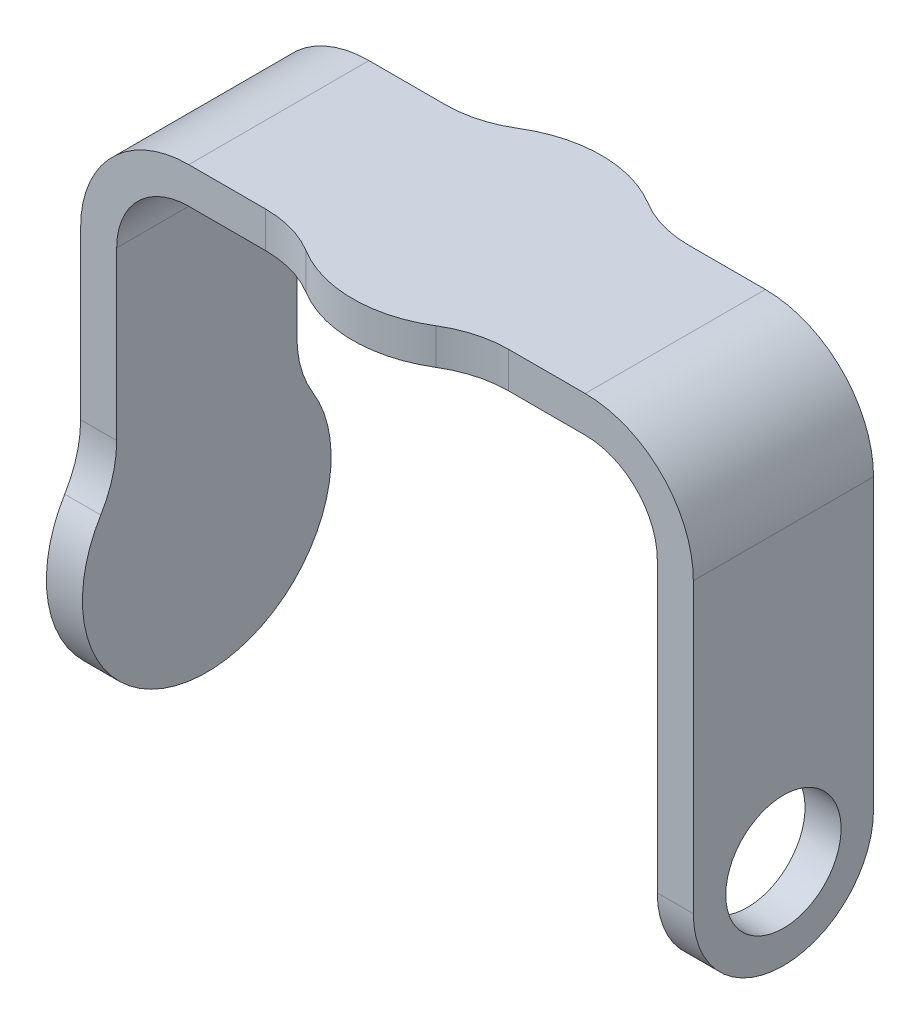
ISO-10303-21;
HEADER;
FILE_DESCRIPTION(('STEP AP214'),'2;1');
FILE_NAME('part.step','',(''),(''),'','','');
FILE_SCHEMA(('AUTOMOTIVE_DESIGN { 1 0 10303 214 1 1 1 1 }'));
ENDSEC;
DATA;
#1=APPLICATION_CONTEXT('core data for automotive mechanical design processes');
#2=APPLICATION_PROTOCOL_DEFINITION('international standard','automotive_design',2000,#1);
#3=PRODUCT_CONTEXT('',#1,'mechanical');
#4=PRODUCT('Part','Part','',(#3));
#5=PRODUCT_RELATED_PRODUCT_CATEGORY('part','',(#4));
#6=PRODUCT_DEFINITION_FORMATION('','',#4);
#7=PRODUCT_DEFINITION_CONTEXT('part definition',#1,'design');
#8=PRODUCT_DEFINITION('design','',#6,#7);
#9=PRODUCT_DEFINITION_SHAPE('','',#8);
#10=(LENGTH_UNIT() NAMED_UNIT(*) SI_UNIT(.MILLI.,.METRE.));
#11=(NAMED_UNIT(*) PLANE_ANGLE_UNIT() SI_UNIT($,.RADIAN.));
#12=(NAMED_UNIT(*) SI_UNIT($,.STERADIAN.) SOLID_ANGLE_UNIT());
#13=UNCERTAINTY_MEASURE_WITH_UNIT(LENGTH_MEASURE(1.E-05),#10,'distance_accuracy_value','');
#14=(GEOMETRIC_REPRESENTATION_CONTEXT(3) GLOBAL_UNCERTAINTY_ASSIGNED_CONTEXT((#13)) GLOBAL_UNIT_ASSIGNED_CONTEXT((#10,
#11,#12)) REPRESENTATION_CONTEXT('',''));
#15=CARTESIAN_POINT('',(0.,0.,0.));
#16=DIRECTION('',(0.,0.,1.));
#17=DIRECTION('',(1.,0.,0.));
#18=AXIS2_PLACEMENT_3D('',#15,#16,#17);
#19=CARTESIAN_POINT('',(-27.5,-10.,12.5));
#20=DIRECTION('',(0.,0.,-1.));
#21=DIRECTION('',(-1.,0.,0.));
#22=AXIS2_PLACEMENT_3D('',#19,#20,#21);
#23=PLANE('',#22);
#24=DIRECTION('',(0.,-1.,0.));
#25=VECTOR('',#24,1.);
#26=CARTESIAN_POINT('',(-42.5,-10.0000000000001,12.5));
#27=LINE('',#26,#25);
#28=CARTESIAN_POINT('',(-42.5,-10.0000000000001,12.5));
#29=VERTEX_POINT('',#28);
#30=CARTESIAN_POINT('',(-42.5,-33.1532644111686,12.5));
#31=VERTEX_POINT('',#30);
#32=EDGE_CURVE('E227',#29,#31,#27,.T.);
#33=ORIENTED_EDGE('',*,*,#32,.T.);
#34=DIRECTION('',(-1.,0.,0.));
#35=VECTOR('',#34,1.);
#36=CARTESIAN_POINT('',(-27.5,-33.1532644111686,12.5));
#37=LINE('',#36,#35);
#38=CARTESIAN_POINT('',(-37.5,-33.1532644111686,12.5));
#39=VERTEX_POINT('',#38);
#40=EDGE_CURVE('E361',#31,#39,#37,.F.);
#41=ORIENTED_EDGE('',*,*,#40,.T.);
#42=DIRECTION('',(0.,1.,0.));
#43=VECTOR('',#42,1.);
#44=CARTESIAN_POINT('',(-37.5,-67.25,12.5));
#45=LINE('',#44,#43);
#46=CARTESIAN_POINT('',(-37.5,-10.0000000000001,12.5));
#47=VERTEX_POINT('',#46);
#48=EDGE_CURVE('E269',#39,#47,#45,.T.);
#49=ORIENTED_EDGE('',*,*,#48,.T.);
#50=CARTESIAN_POINT('',(-27.5,-10.,12.5));
#51=DIRECTION('',(0.,0.,-1.));
#52=DIRECTION('',(-1.,0.,0.));
#53=AXIS2_PLACEMENT_3D('',#50,#51,#52);
#54=CIRCLE('',#53,10.);
#55=CARTESIAN_POINT('',(-27.4999999999999,0.,12.5));
#56=VERTEX_POINT('',#55);
#57=EDGE_CURVE('E427',#47,#56,#54,.T.);
#58=ORIENTED_EDGE('',*,*,#57,.T.);
#59=DIRECTION('',(1.,0.,0.));
#60=VECTOR('',#59,1.);
#61=CARTESIAN_POINT('',(-27.4999999999999,0.,12.5));
#62=LINE('',#61,#60);
#63=CARTESIAN_POINT('',(-16.8467355888314,0.,12.5));
#64=VERTEX_POINT('',#63);
#65=EDGE_CURVE('E431',#56,#64,#62,.T.);
#66=ORIENTED_EDGE('',*,*,#65,.T.);
#67=DIRECTION('',(0.,1.,0.));
#68=VECTOR('',#67,1.);
#69=CARTESIAN_POINT('',(-16.8467355888314,-10.,12.5));
#70=LINE('',#69,#68);
#71=CARTESIAN_POINT('',(-16.8467355888315,4.99999999999999,12.5));
#72=VERTEX_POINT('',#71);
#73=EDGE_CURVE('E309',#64,#72,#70,.T.);
#74=ORIENTED_EDGE('',*,*,#73,.T.);
#75=DIRECTION('',(-1.,0.,0.));
#76=VECTOR('',#75,1.);
#77=CARTESIAN_POINT('',(27.4999999999999,5.,12.5));
#78=LINE('',#77,#76);
#79=CARTESIAN_POINT('',(-27.4999999999999,4.99999999999999,12.5));
#80=VERTEX_POINT('',#79);
#81=EDGE_CURVE('E214',#72,#80,#78,.T.);
#82=ORIENTED_EDGE('',*,*,#81,.T.);
#83=CARTESIAN_POINT('',(-27.5,-10.,12.5));
#84=DIRECTION('',(0.,0.,1.));
#85=DIRECTION('',(1.,0.,0.));
#86=AXIS2_PLACEMENT_3D('',#83,#84,#85);
#87=CIRCLE('',#86,15.);
#88=EDGE_CURVE('E224',#80,#29,#87,.T.);
#89=ORIENTED_EDGE('',*,*,#88,.T.);
#90=EDGE_LOOP('',(#33,#41,#49,#58,#66,#74,#82,#89));
#91=FACE_BOUND('',#90,.T.);
#92=ADVANCED_FACE('F39',(#91),#23,.F.);
#93=CARTESIAN_POINT('',(-27.5,-10.,-12.5));
#94=DIRECTION('',(0.,0.,-1.));
#95=DIRECTION('',(-1.,0.,0.));
#96=AXIS2_PLACEMENT_3D('',#93,#94,#95);
#97=PLANE('',#96);
#98=DIRECTION('',(0.,1.,0.));
#99=VECTOR('',#98,1.);
#100=CARTESIAN_POINT('',(-37.5,-67.25,-12.5));
#101=LINE('',#100,#99);
#102=CARTESIAN_POINT('',(-37.5,-33.1532644111686,-12.5));
#103=VERTEX_POINT('',#102);
#104=CARTESIAN_POINT('',(-37.5,-10.0000000000001,-12.5));
#105=VERTEX_POINT('',#104);
#106=EDGE_CURVE('E232',#103,#105,#101,.T.);
#107=ORIENTED_EDGE('',*,*,#106,.F.);
#108=DIRECTION('',(1.,0.,0.));
#109=VECTOR('',#108,1.);
#110=CARTESIAN_POINT('',(-42.5,-33.1532644111686,-12.5));
#111=LINE('',#110,#109);
#112=CARTESIAN_POINT('',(-42.5,-33.1532644111686,-12.5));
#113=VERTEX_POINT('',#112);
#114=EDGE_CURVE('E358',#103,#113,#111,.F.);
#115=ORIENTED_EDGE('',*,*,#114,.T.);
#116=DIRECTION('',(0.,-1.,0.));
#117=VECTOR('',#116,1.);
#118=CARTESIAN_POINT('',(-42.5,-10.0000000000001,-12.5));
#119=LINE('',#118,#117);
#120=CARTESIAN_POINT('',(-42.5,-10.0000000000001,-12.5));
#121=VERTEX_POINT('',#120);
#122=EDGE_CURVE('E265',#121,#113,#119,.T.);
#123=ORIENTED_EDGE('',*,*,#122,.F.);
#124=CARTESIAN_POINT('',(-27.5,-10.,-12.5));
#125=DIRECTION('',(0.,0.,1.));
#126=DIRECTION('',(1.,0.,0.));
#127=AXIS2_PLACEMENT_3D('',#124,#125,#126);
#128=CIRCLE('',#127,15.);
#129=CARTESIAN_POINT('',(-27.4999999999999,4.99999999999999,-12.5));
#130=VERTEX_POINT('',#129);
#131=EDGE_CURVE('E262',#130,#121,#128,.T.);
#132=ORIENTED_EDGE('',*,*,#131,.F.);
#133=DIRECTION('',(-1.,0.,0.));
#134=VECTOR('',#133,1.);
#135=CARTESIAN_POINT('',(27.4999999999999,5.,-12.5));
#136=LINE('',#135,#134);
#137=CARTESIAN_POINT('',(-16.8467355888315,4.99999999999999,-12.5));
#138=VERTEX_POINT('',#137);
#139=EDGE_CURVE('E257',#138,#130,#136,.T.);
#140=ORIENTED_EDGE('',*,*,#139,.F.);
#141=DIRECTION('',(0.,-1.,0.));
#142=VECTOR('',#141,1.);
#143=CARTESIAN_POINT('',(-16.8467355888314,0.,-12.5));
#144=LINE('',#143,#142);
#145=CARTESIAN_POINT('',(-16.8467355888314,0.,-12.5));
#146=VERTEX_POINT('',#145);
#147=EDGE_CURVE('E321',#138,#146,#144,.T.);
#148=ORIENTED_EDGE('',*,*,#147,.T.);
#149=DIRECTION('',(1.,0.,0.));
#150=VECTOR('',#149,1.);
#151=CARTESIAN_POINT('',(-27.4999999999999,0.,-12.5));
#152=LINE('',#151,#150);
#153=CARTESIAN_POINT('',(-27.4999999999999,0.,-12.5));
#154=VERTEX_POINT('',#153);
#155=EDGE_CURVE('E240',#154,#146,#152,.T.);
#156=ORIENTED_EDGE('',*,*,#155,.F.);
#157=CARTESIAN_POINT('',(-27.5,-10.,-12.5));
#158=DIRECTION('',(0.,0.,-1.));
#159=DIRECTION('',(-1.,0.,0.));
#160=AXIS2_PLACEMENT_3D('',#157,#158,#159);
#161=CIRCLE('',#160,10.);
#162=EDGE_CURVE('E235',#105,#154,#161,.T.);
#163=ORIENTED_EDGE('',*,*,#162,.F.);
#164=EDGE_LOOP('',(#107,#115,#123,#132,#140,#148,#156,#163));
#165=FACE_BOUND('',#164,.T.);
#166=ADVANCED_FACE('F402',(#165),#97,.T.);
#167=CARTESIAN_POINT('',(-37.5,-67.25,12.5));
#168=DIRECTION('',(-1.,0.,0.));
#169=DIRECTION('',(0.,0.,1.));
#170=AXIS2_PLACEMENT_3D('',#167,#168,#169);
#171=PLANE('',#170);
#172=ORIENTED_EDGE('',*,*,#48,.F.);
#173=CARTESIAN_POINT('',(-37.5,-33.1532644111686,27.5));
#174=DIRECTION('',(-1.,0.,0.));
#175=DIRECTION('',(0.,0.,1.));
#176=AXIS2_PLACEMENT_3D('',#173,#174,#175);
#177=CIRCLE('',#176,15.);
#178=CARTESIAN_POINT('',(-37.5,-40.9889553827181,14.7093023255814));
#179=VERTEX_POINT('',#178);
#180=EDGE_CURVE('E48',#39,#179,#177,.T.);
#181=ORIENTED_EDGE('',*,*,#180,.T.);
#182=CARTESIAN_POINT('',(-37.5,-50.,0.));
#183=DIRECTION('',(-1.,0.,0.));
#184=DIRECTION('',(0.,-1.,0.));
#185=AXIS2_PLACEMENT_3D('',#182,#183,#184);
#186=CIRCLE('',#185,17.25);
#187=CARTESIAN_POINT('',(-37.5,-40.9889553827181,-14.7093023255814));
#188=VERTEX_POINT('',#187);
#189=EDGE_CURVE('E375',#188,#179,#186,.T.);
#190=ORIENTED_EDGE('',*,*,#189,.F.);
#191=CARTESIAN_POINT('',(-37.5,-33.1532644111686,-27.5));
#192=DIRECTION('',(-1.,0.,0.));
#193=DIRECTION('',(0.,0.,1.));
#194=AXIS2_PLACEMENT_3D('',#191,#192,#193);
#195=CIRCLE('',#194,15.);
#196=EDGE_CURVE('E364',#188,#103,#195,.T.);
#197=ORIENTED_EDGE('',*,*,#196,.T.);
#198=ORIENTED_EDGE('',*,*,#106,.T.);
#199=DIRECTION('',(0.,0.,-1.));
#200=VECTOR('',#199,1.);
#201=CARTESIAN_POINT('',(-37.5,-10.0000000000001,12.5));
#202=LINE('',#201,#200);
#203=EDGE_CURVE('E295',#47,#105,#202,.T.);
#204=ORIENTED_EDGE('',*,*,#203,.F.);
#205=EDGE_LOOP('',(#172,#181,#190,#197,#198,#204));
#206=FACE_BOUND('',#205,.T.);
#207=ADVANCED_FACE('F374',(#206),#171,.F.);
#208=CARTESIAN_POINT('',(-27.5,-10.,12.5));
#209=DIRECTION('',(0.,0.,-1.));
#210=DIRECTION('',(-1.,0.,0.));
#211=AXIS2_PLACEMENT_3D('',#208,#209,#210);
#212=CYLINDRICAL_SURFACE('',#211,10.);
#213=ORIENTED_EDGE('',*,*,#162,.T.);
#214=DIRECTION('',(0.,0.,-1.));
#215=VECTOR('',#214,1.);
#216=CARTESIAN_POINT('',(-27.4999999999999,0.,12.5));
#217=LINE('',#216,#215);
#218=EDGE_CURVE('E291',#56,#154,#217,.T.);
#219=ORIENTED_EDGE('',*,*,#218,.F.);
#220=ORIENTED_EDGE('',*,*,#57,.F.);
#221=ORIENTED_EDGE('',*,*,#203,.T.);
#222=EDGE_LOOP('',(#213,#219,#220,#221));
#223=FACE_BOUND('',#222,.T.);
#224=ADVANCED_FACE('F540',(#223),#212,.F.);
#225=CARTESIAN_POINT('',(-27.4999999999999,0.,12.5));
#226=DIRECTION('',(0.,1.,0.));
#227=DIRECTION('',(0.,0.,1.));
#228=AXIS2_PLACEMENT_3D('',#225,#226,#227);
#229=PLANE('',#228);
#230=ORIENTED_EDGE('',*,*,#155,.T.);
#231=CARTESIAN_POINT('',(-16.8467355888314,0.,-27.5));
#232=DIRECTION('',(0.,1.,0.));
#233=DIRECTION('',(0.,0.,1.));
#234=AXIS2_PLACEMENT_3D('',#231,#232,#233);
#235=CIRCLE('',#234,15.);
#236=CARTESIAN_POINT('',(-9.01104461728194,0.,-14.7093023255814));
#237=VERTEX_POINT('',#236);
#238=EDGE_CURVE('E342',#146,#237,#235,.T.);
#239=ORIENTED_EDGE('',*,*,#238,.T.);
#240=CARTESIAN_POINT('',(0.,0.,0.));
#241=DIRECTION('',(0.,1.,0.));
#242=DIRECTION('',(-1.,0.,0.));
#243=AXIS2_PLACEMENT_3D('',#240,#241,#242);
#244=CIRCLE('',#243,17.25);
#245=CARTESIAN_POINT('',(9.01104461728194,0.,-14.7093023255814));
#246=VERTEX_POINT('',#245);
#247=EDGE_CURVE('E417',#246,#237,#244,.T.);
#248=ORIENTED_EDGE('',*,*,#247,.F.);
#249=CARTESIAN_POINT('',(16.8467355888314,0.,-27.5));
#250=DIRECTION('',(0.,1.,0.));
#251=DIRECTION('',(0.,0.,1.));
#252=AXIS2_PLACEMENT_3D('',#249,#250,#251);
#253=CIRCLE('',#252,15.);
#254=CARTESIAN_POINT('',(16.8467355888314,0.,-12.5));
#255=VERTEX_POINT('',#254);
#256=EDGE_CURVE('E345',#246,#255,#253,.T.);
#257=ORIENTED_EDGE('',*,*,#256,.T.);
#258=CARTESIAN_POINT('',(27.4999999999999,0.,-12.5));
#259=VERTEX_POINT('',#258);
#260=EDGE_CURVE('E239',#255,#259,#152,.T.);
#261=ORIENTED_EDGE('',*,*,#260,.T.);
#262=DIRECTION('',(0.,0.,-1.));
#263=VECTOR('',#262,1.);
#264=CARTESIAN_POINT('',(27.4999999999999,0.,12.5));
#265=LINE('',#264,#263);
#266=CARTESIAN_POINT('',(27.4999999999999,0.,12.5));
#267=VERTEX_POINT('',#266);
#268=EDGE_CURVE('E287',#267,#259,#265,.T.);
#269=ORIENTED_EDGE('',*,*,#268,.F.);
#270=CARTESIAN_POINT('',(16.8467355888314,0.,12.5));
#271=VERTEX_POINT('',#270);
#272=EDGE_CURVE('E430',#271,#267,#62,.T.);
#273=ORIENTED_EDGE('',*,*,#272,.F.);
#274=CARTESIAN_POINT('',(16.8467355888314,0.,27.5));
#275=DIRECTION('',(0.,1.,0.));
#276=DIRECTION('',(0.,0.,1.));
#277=AXIS2_PLACEMENT_3D('',#274,#275,#276);
#278=CIRCLE('',#277,15.);
#279=CARTESIAN_POINT('',(9.01104461728194,0.,14.7093023255814));
#280=VERTEX_POINT('',#279);
#281=EDGE_CURVE('E327',#271,#280,#278,.T.);
#282=ORIENTED_EDGE('',*,*,#281,.T.);
#283=CARTESIAN_POINT('',(-9.01104461728194,0.,14.7093023255814));
#284=VERTEX_POINT('',#283);
#285=EDGE_CURVE('E236',#284,#280,#244,.T.);
#286=ORIENTED_EDGE('',*,*,#285,.F.);
#287=CARTESIAN_POINT('',(-16.8467355888314,0.,27.5));
#288=DIRECTION('',(0.,1.,0.));
#289=DIRECTION('',(0.,0.,1.));
#290=AXIS2_PLACEMENT_3D('',#287,#288,#289);
#291=CIRCLE('',#290,15.);
#292=EDGE_CURVE('E336',#284,#64,#291,.T.);
#293=ORIENTED_EDGE('',*,*,#292,.T.);
#294=ORIENTED_EDGE('',*,*,#65,.F.);
#295=ORIENTED_EDGE('',*,*,#218,.T.);
#296=EDGE_LOOP('',(#230,#239,#248,#257,#261,#269,#273,#282,#286,#293,#294,#295));
#297=FACE_BOUND('',#296,.T.);
#298=ADVANCED_FACE('F465',(#297),#229,.F.);
#299=CARTESIAN_POINT('',(27.5,-10.,12.5));
#300=DIRECTION('',(0.,0.,-1.));
#301=DIRECTION('',(-1.,0.,0.));
#302=AXIS2_PLACEMENT_3D('',#299,#300,#301);
#303=CYLINDRICAL_SURFACE('',#302,10.);
#304=CARTESIAN_POINT('',(27.5,-10.,-12.5));
#305=DIRECTION('',(0.,0.,-1.));
#306=DIRECTION('',(-1.,0.,0.));
#307=AXIS2_PLACEMENT_3D('',#304,#305,#306);
#308=CIRCLE('',#307,10.);
#309=CARTESIAN_POINT('',(37.5,-10.0000000000001,-12.5));
#310=VERTEX_POINT('',#309);
#311=EDGE_CURVE('E244',#259,#310,#308,.T.);
#312=ORIENTED_EDGE('',*,*,#311,.T.);
#313=DIRECTION('',(0.,0.,-1.));
#314=VECTOR('',#313,1.);
#315=CARTESIAN_POINT('',(37.5,-10.0000000000001,12.5));
#316=LINE('',#315,#314);
#317=CARTESIAN_POINT('',(37.5,-10.0000000000001,12.5));
#318=VERTEX_POINT('',#317);
#319=EDGE_CURVE('E283',#318,#310,#316,.T.);
#320=ORIENTED_EDGE('',*,*,#319,.F.);
#321=CARTESIAN_POINT('',(27.5,-10.,12.5));
#322=DIRECTION('',(0.,0.,-1.));
#323=DIRECTION('',(-1.,0.,0.));
#324=AXIS2_PLACEMENT_3D('',#321,#322,#323);
#325=CIRCLE('',#324,10.);
#326=EDGE_CURVE('E216',#267,#318,#325,.T.);
#327=ORIENTED_EDGE('',*,*,#326,.F.);
#328=ORIENTED_EDGE('',*,*,#268,.T.);
#329=EDGE_LOOP('',(#312,#320,#327,#328));
#330=FACE_BOUND('',#329,.T.);
#331=ADVANCED_FACE('F440',(#330),#303,.F.);
#332=CARTESIAN_POINT('',(37.5,-10.0000000000001,12.5));
#333=DIRECTION('',(1.,0.,0.));
#334=DIRECTION('',(0.,0.,-1.));
#335=AXIS2_PLACEMENT_3D('',#332,#333,#334);
#336=PLANE('',#335);
#337=CARTESIAN_POINT('',(37.5,-50.,0.));
#338=DIRECTION('',(-1.,0.,0.));
#339=DIRECTION('',(0.,0.,1.));
#340=AXIS2_PLACEMENT_3D('',#337,#338,#339);
#341=CIRCLE('',#340,8.);
#342=CARTESIAN_POINT('',(37.5,-50.,8.));
#343=VERTEX_POINT('',#342);
#344=EDGE_CURVE('E413',#343,#343,#341,.T.);
#345=ORIENTED_EDGE('',*,*,#344,.F.);
#346=EDGE_LOOP('',(#345));
#347=FACE_BOUND('',#346,.T.);
#348=DIRECTION('',(0.,-1.,0.));
#349=VECTOR('',#348,1.);
#350=CARTESIAN_POINT('',(37.5,-10.0000000000001,-12.5));
#351=LINE('',#350,#349);
#352=CARTESIAN_POINT('',(37.5,-50.,-12.5));
#353=VERTEX_POINT('',#352);
#354=EDGE_CURVE('E247',#310,#353,#351,.T.);
#355=ORIENTED_EDGE('',*,*,#354,.T.);
#356=CARTESIAN_POINT('',(37.5,-50.,0.));
#357=DIRECTION('',(1.,0.,0.));
#358=DIRECTION('',(0.,0.,1.));
#359=AXIS2_PLACEMENT_3D('',#356,#357,#358);
#360=CIRCLE('',#359,12.5);
#361=CARTESIAN_POINT('',(37.5,-50.,12.5));
#362=VERTEX_POINT('',#361);
#363=EDGE_CURVE('E55',#362,#353,#360,.T.);
#364=ORIENTED_EDGE('',*,*,#363,.F.);
#365=DIRECTION('',(0.,-1.,0.));
#366=VECTOR('',#365,1.);
#367=CARTESIAN_POINT('',(37.5,-10.0000000000001,12.5));
#368=LINE('',#367,#366);
#369=EDGE_CURVE('E202',#318,#362,#368,.T.);
#370=ORIENTED_EDGE('',*,*,#369,.F.);
#371=ORIENTED_EDGE('',*,*,#319,.T.);
#372=EDGE_LOOP('',(#355,#364,#370,#371));
#373=FACE_BOUND('',#372,.T.);
#374=ADVANCED_FACE('F444',(#347,#373),#336,.F.);
#375=CARTESIAN_POINT('',(42.5,-67.25,12.5));
#376=DIRECTION('',(-1.,0.,0.));
#377=DIRECTION('',(0.,-1.,0.));
#378=AXIS2_PLACEMENT_3D('',#375,#376,#377);
#379=PLANE('',#378);
#380=CARTESIAN_POINT('',(42.5,-50.,0.));
#381=DIRECTION('',(-1.,0.,0.));
#382=DIRECTION('',(0.,0.,1.));
#383=AXIS2_PLACEMENT_3D('',#380,#381,#382);
#384=CIRCLE('',#383,8.);
#385=CARTESIAN_POINT('',(42.5,-50.,8.));
#386=VERTEX_POINT('',#385);
#387=EDGE_CURVE('E409',#386,#386,#384,.T.);
#388=ORIENTED_EDGE('',*,*,#387,.T.);
#389=EDGE_LOOP('',(#388));
#390=FACE_BOUND('',#389,.T.);
#391=DIRECTION('',(0.,1.,0.));
#392=VECTOR('',#391,1.);
#393=CARTESIAN_POINT('',(42.5,-67.25,12.5));
#394=LINE('',#393,#392);
#395=CARTESIAN_POINT('',(42.5,-50.,12.5));
#396=VERTEX_POINT('',#395);
#397=CARTESIAN_POINT('',(42.5,-10.0000000000001,12.5));
#398=VERTEX_POINT('',#397);
#399=EDGE_CURVE('E199',#396,#398,#394,.T.);
#400=ORIENTED_EDGE('',*,*,#399,.F.);
#401=CARTESIAN_POINT('',(42.5,-50.,0.));
#402=DIRECTION('',(1.,0.,0.));
#403=DIRECTION('',(0.,0.,1.));
#404=AXIS2_PLACEMENT_3D('',#401,#402,#403);
#405=CIRCLE('',#404,12.5);
#406=CARTESIAN_POINT('',(42.5,-50.,-12.5));
#407=VERTEX_POINT('',#406);
#408=EDGE_CURVE('E186',#396,#407,#405,.T.);
#409=ORIENTED_EDGE('',*,*,#408,.T.);
#410=DIRECTION('',(0.,1.,0.));
#411=VECTOR('',#410,1.);
#412=CARTESIAN_POINT('',(42.5,-67.25,-12.5));
#413=LINE('',#412,#411);
#414=CARTESIAN_POINT('',(42.5,-10.0000000000001,-12.5));
#415=VERTEX_POINT('',#414);
#416=EDGE_CURVE('E251',#407,#415,#413,.T.);
#417=ORIENTED_EDGE('',*,*,#416,.T.);
#418=DIRECTION('',(0.,0.,-1.));
#419=VECTOR('',#418,1.);
#420=CARTESIAN_POINT('',(42.5,-10.0000000000001,12.5));
#421=LINE('',#420,#419);
#422=EDGE_CURVE('E207',#398,#415,#421,.T.);
#423=ORIENTED_EDGE('',*,*,#422,.F.);
#424=EDGE_LOOP('',(#400,#409,#417,#423));
#425=FACE_BOUND('',#424,.T.);
#426=ADVANCED_FACE('F205',(#390,#425),#379,.F.);
#427=CARTESIAN_POINT('',(27.5,-9.99999999999999,12.5));
#428=DIRECTION('',(0.,0.,-1.));
#429=DIRECTION('',(-1.,0.,0.));
#430=AXIS2_PLACEMENT_3D('',#427,#428,#429);
#431=CYLINDRICAL_SURFACE('',#430,15.);
#432=CARTESIAN_POINT('',(27.5,-9.99999999999999,-12.5));
#433=DIRECTION('',(0.,0.,1.));
#434=DIRECTION('',(1.,0.,0.));
#435=AXIS2_PLACEMENT_3D('',#432,#433,#434);
#436=CIRCLE('',#435,15.);
#437=CARTESIAN_POINT('',(27.4999999999999,5.,-12.5));
#438=VERTEX_POINT('',#437);
#439=EDGE_CURVE('E254',#415,#438,#436,.T.);
#440=ORIENTED_EDGE('',*,*,#439,.T.);
#441=DIRECTION('',(0.,0.,-1.));
#442=VECTOR('',#441,1.);
#443=CARTESIAN_POINT('',(27.4999999999999,5.,12.5));
#444=LINE('',#443,#442);
#445=CARTESIAN_POINT('',(27.4999999999999,5.,12.5));
#446=VERTEX_POINT('',#445);
#447=EDGE_CURVE('E277',#446,#438,#444,.T.);
#448=ORIENTED_EDGE('',*,*,#447,.F.);
#449=CARTESIAN_POINT('',(27.5,-9.99999999999999,12.5));
#450=DIRECTION('',(0.,0.,1.));
#451=DIRECTION('',(1.,0.,0.));
#452=AXIS2_PLACEMENT_3D('',#449,#450,#451);
#453=CIRCLE('',#452,15.);
#454=EDGE_CURVE('E210',#398,#446,#453,.T.);
#455=ORIENTED_EDGE('',*,*,#454,.F.);
#456=ORIENTED_EDGE('',*,*,#422,.T.);
#457=EDGE_LOOP('',(#440,#448,#455,#456));
#458=FACE_BOUND('',#457,.T.);
#459=ADVANCED_FACE('F461',(#458),#431,.T.);
#460=CARTESIAN_POINT('',(27.4999999999999,5.,12.5));
#461=DIRECTION('',(0.,-1.,0.));
#462=DIRECTION('',(1.,0.,0.));
#463=AXIS2_PLACEMENT_3D('',#460,#461,#462);
#464=PLANE('',#463);
#465=CARTESIAN_POINT('',(16.8467355888314,5.,-12.5));
#466=VERTEX_POINT('',#465);
#467=EDGE_CURVE('E258',#438,#466,#136,.T.);
#468=ORIENTED_EDGE('',*,*,#467,.T.);
#469=CARTESIAN_POINT('',(16.8467355888314,5.,-27.5));
#470=DIRECTION('',(0.,-1.,0.));
#471=DIRECTION('',(1.,0.,0.));
#472=AXIS2_PLACEMENT_3D('',#469,#470,#471);
#473=CIRCLE('',#472,15.);
#474=CARTESIAN_POINT('',(9.01104461728194,5.,-14.7093023255814));
#475=VERTEX_POINT('',#474);
#476=EDGE_CURVE('E348',#466,#475,#473,.T.);
#477=ORIENTED_EDGE('',*,*,#476,.T.);
#478=CARTESIAN_POINT('',(0.,5.,0.));
#479=DIRECTION('',(0.,1.,0.));
#480=DIRECTION('',(-1.,0.,0.));
#481=AXIS2_PLACEMENT_3D('',#478,#479,#480);
#482=CIRCLE('',#481,17.25);
#483=CARTESIAN_POINT('',(-9.01104461728194,5.,-14.7093023255814));
#484=VERTEX_POINT('',#483);
#485=EDGE_CURVE('E383',#475,#484,#482,.T.);
#486=ORIENTED_EDGE('',*,*,#485,.T.);
#487=CARTESIAN_POINT('',(-16.8467355888314,4.99999999999999,-27.5));
#488=DIRECTION('',(0.,-1.,0.));
#489=DIRECTION('',(1.,0.,0.));
#490=AXIS2_PLACEMENT_3D('',#487,#488,#489);
#491=CIRCLE('',#490,15.);
#492=EDGE_CURVE('E339',#484,#138,#491,.T.);
#493=ORIENTED_EDGE('',*,*,#492,.T.);
#494=ORIENTED_EDGE('',*,*,#139,.T.);
#495=DIRECTION('',(0.,0.,-1.));
#496=VECTOR('',#495,1.);
#497=CARTESIAN_POINT('',(-27.4999999999999,4.99999999999999,12.5));
#498=LINE('',#497,#496);
#499=EDGE_CURVE('E273',#80,#130,#498,.T.);
#500=ORIENTED_EDGE('',*,*,#499,.F.);
#501=ORIENTED_EDGE('',*,*,#81,.F.);
#502=CARTESIAN_POINT('',(-16.8467355888314,4.99999999999999,27.5));
#503=DIRECTION('',(0.,-1.,0.));
#504=DIRECTION('',(1.,0.,0.));
#505=AXIS2_PLACEMENT_3D('',#502,#503,#504);
#506=CIRCLE('',#505,15.);
#507=CARTESIAN_POINT('',(-9.01104461728194,5.,14.7093023255814));
#508=VERTEX_POINT('',#507);
#509=EDGE_CURVE('E333',#72,#508,#506,.T.);
#510=ORIENTED_EDGE('',*,*,#509,.T.);
#511=CARTESIAN_POINT('',(9.01104461728194,5.,14.7093023255814));
#512=VERTEX_POINT('',#511);
#513=EDGE_CURVE('E421',#508,#512,#482,.T.);
#514=ORIENTED_EDGE('',*,*,#513,.T.);
#515=CARTESIAN_POINT('',(16.8467355888314,5.,27.5));
#516=DIRECTION('',(0.,-1.,0.));
#517=DIRECTION('',(1.,0.,0.));
#518=AXIS2_PLACEMENT_3D('',#515,#516,#517);
#519=CIRCLE('',#518,15.);
#520=CARTESIAN_POINT('',(16.8467355888314,5.,12.5));
#521=VERTEX_POINT('',#520);
#522=EDGE_CURVE('E330',#512,#521,#519,.T.);
#523=ORIENTED_EDGE('',*,*,#522,.T.);
#524=EDGE_CURVE('E220',#446,#521,#78,.T.);
#525=ORIENTED_EDGE('',*,*,#524,.F.);
#526=ORIENTED_EDGE('',*,*,#447,.T.);
#527=EDGE_LOOP('',(#468,#477,#486,#493,#494,#500,#501,#510,#514,#523,#525,#526));
#528=FACE_BOUND('',#527,.T.);
#529=ADVANCED_FACE('F489',(#528),#464,.F.);
#530=CARTESIAN_POINT('',(-27.5,-10.,12.5));
#531=DIRECTION('',(0.,0.,-1.));
#532=DIRECTION('',(-1.,0.,0.));
#533=AXIS2_PLACEMENT_3D('',#530,#531,#532);
#534=CYLINDRICAL_SURFACE('',#533,15.);
#535=ORIENTED_EDGE('',*,*,#131,.T.);
#536=DIRECTION('',(0.,0.,-1.));
#537=VECTOR('',#536,1.);
#538=CARTESIAN_POINT('',(-42.5,-10.0000000000001,12.5));
#539=LINE('',#538,#537);
#540=EDGE_CURVE('E231',#29,#121,#539,.T.);
#541=ORIENTED_EDGE('',*,*,#540,.F.);
#542=ORIENTED_EDGE('',*,*,#88,.F.);
#543=ORIENTED_EDGE('',*,*,#499,.T.);
#544=EDGE_LOOP('',(#535,#541,#542,#543));
#545=FACE_BOUND('',#544,.T.);
#546=ADVANCED_FACE('F396',(#545),#534,.T.);
#547=CARTESIAN_POINT('',(-42.5,-10.0000000000001,12.5));
#548=DIRECTION('',(1.,0.,0.));
#549=DIRECTION('',(0.,1.,0.));
#550=AXIS2_PLACEMENT_3D('',#547,#548,#549);
#551=PLANE('',#550);
#552=ORIENTED_EDGE('',*,*,#122,.T.);
#553=CARTESIAN_POINT('',(-42.5,-33.1532644111686,-27.5));
#554=DIRECTION('',(1.,0.,0.));
#555=DIRECTION('',(0.,1.,0.));
#556=AXIS2_PLACEMENT_3D('',#553,#554,#555);
#557=CIRCLE('',#556,15.);
#558=CARTESIAN_POINT('',(-42.5,-40.9889553827181,-14.7093023255814));
#559=VERTEX_POINT('',#558);
#560=EDGE_CURVE('E367',#113,#559,#557,.T.);
#561=ORIENTED_EDGE('',*,*,#560,.T.);
#562=CARTESIAN_POINT('',(-42.5,-50.,0.));
#563=DIRECTION('',(-1.,0.,0.));
#564=DIRECTION('',(0.,-1.,0.));
#565=AXIS2_PLACEMENT_3D('',#562,#563,#564);
#566=CIRCLE('',#565,17.25);
#567=CARTESIAN_POINT('',(-42.5,-40.9889553827181,14.7093023255814));
#568=VERTEX_POINT('',#567);
#569=EDGE_CURVE('E384',#559,#568,#566,.T.);
#570=ORIENTED_EDGE('',*,*,#569,.T.);
#571=CARTESIAN_POINT('',(-42.5,-33.1532644111686,27.5));
#572=DIRECTION('',(1.,0.,0.));
#573=DIRECTION('',(0.,1.,0.));
#574=AXIS2_PLACEMENT_3D('',#571,#572,#573);
#575=CIRCLE('',#574,15.);
#576=EDGE_CURVE('E11',#568,#31,#575,.T.);
#577=ORIENTED_EDGE('',*,*,#576,.T.);
#578=ORIENTED_EDGE('',*,*,#32,.F.);
#579=ORIENTED_EDGE('',*,*,#540,.T.);
#580=EDGE_LOOP('',(#552,#561,#570,#577,#578,#579));
#581=FACE_BOUND('',#580,.T.);
#582=ADVANCED_FACE('F389',(#581),#551,.F.);
#583=ORIENTED_EDGE('',*,*,#369,.T.);
#584=DIRECTION('',(-1.,0.,0.));
#585=VECTOR('',#584,1.);
#586=CARTESIAN_POINT('',(42.5,-50.,12.5));
#587=LINE('',#586,#585);
#588=EDGE_CURVE('E189',#396,#362,#587,.T.);
#589=ORIENTED_EDGE('',*,*,#588,.F.);
#590=ORIENTED_EDGE('',*,*,#399,.T.);
#591=ORIENTED_EDGE('',*,*,#454,.T.);
#592=ORIENTED_EDGE('',*,*,#524,.T.);
#593=DIRECTION('',(0.,1.,0.));
#594=VECTOR('',#593,1.);
#595=CARTESIAN_POINT('',(16.8467355888314,-9.99999999999999,12.5));
#596=LINE('',#595,#594);
#597=EDGE_CURVE('E299',#521,#271,#596,.F.);
#598=ORIENTED_EDGE('',*,*,#597,.T.);
#599=ORIENTED_EDGE('',*,*,#272,.T.);
#600=ORIENTED_EDGE('',*,*,#326,.T.);
#601=EDGE_LOOP('',(#583,#589,#590,#591,#592,#598,#599,#600));
#602=FACE_BOUND('',#601,.T.);
#603=ADVANCED_FACE('F198',(#602),#23,.F.);
#604=DIRECTION('',(-1.,0.,0.));
#605=VECTOR('',#604,1.);
#606=CARTESIAN_POINT('',(42.5,-50.,-12.5));
#607=LINE('',#606,#605);
#608=EDGE_CURVE('E190',#407,#353,#607,.T.);
#609=ORIENTED_EDGE('',*,*,#608,.T.);
#610=ORIENTED_EDGE('',*,*,#354,.F.);
#611=ORIENTED_EDGE('',*,*,#311,.F.);
#612=ORIENTED_EDGE('',*,*,#260,.F.);
#613=DIRECTION('',(0.,-1.,0.));
#614=VECTOR('',#613,1.);
#615=CARTESIAN_POINT('',(16.8467355888314,5.,-12.5));
#616=LINE('',#615,#614);
#617=EDGE_CURVE('E324',#255,#466,#616,.F.);
#618=ORIENTED_EDGE('',*,*,#617,.T.);
#619=ORIENTED_EDGE('',*,*,#467,.F.);
#620=ORIENTED_EDGE('',*,*,#439,.F.);
#621=ORIENTED_EDGE('',*,*,#416,.F.);
#622=EDGE_LOOP('',(#609,#610,#611,#612,#618,#619,#620,#621));
#623=FACE_BOUND('',#622,.T.);
#624=ADVANCED_FACE('F474',(#623),#97,.T.);
#625=CARTESIAN_POINT('',(0.,0.,0.));
#626=DIRECTION('',(0.,1.,0.));
#627=DIRECTION('',(-1.,0.,0.));
#628=AXIS2_PLACEMENT_3D('',#625,#626,#627);
#629=CYLINDRICAL_SURFACE('',#628,17.25);
#630=ORIENTED_EDGE('',*,*,#247,.T.);
#631=DIRECTION('',(0.,1.,0.));
#632=VECTOR('',#631,1.);
#633=CARTESIAN_POINT('',(-9.01104461728194,0.,-14.7093023255814));
#634=LINE('',#633,#632);
#635=EDGE_CURVE('E317',#237,#484,#634,.T.);
#636=ORIENTED_EDGE('',*,*,#635,.T.);
#637=ORIENTED_EDGE('',*,*,#485,.F.);
#638=DIRECTION('',(0.,1.,0.));
#639=VECTOR('',#638,1.);
#640=CARTESIAN_POINT('',(9.01104461728194,0.,-14.7093023255814));
#641=LINE('',#640,#639);
#642=EDGE_CURVE('E313',#475,#246,#641,.F.);
#643=ORIENTED_EDGE('',*,*,#642,.T.);
#644=EDGE_LOOP('',(#630,#636,#637,#643));
#645=FACE_BOUND('',#644,.T.);
#646=ADVANCED_FACE('F480',(#645),#629,.T.);
#647=ORIENTED_EDGE('',*,*,#285,.T.);
#648=DIRECTION('',(0.,1.,0.));
#649=VECTOR('',#648,1.);
#650=CARTESIAN_POINT('',(9.01104461728194,0.,14.7093023255814));
#651=LINE('',#650,#649);
#652=EDGE_CURVE('E306',#280,#512,#651,.T.);
#653=ORIENTED_EDGE('',*,*,#652,.T.);
#654=ORIENTED_EDGE('',*,*,#513,.F.);
#655=DIRECTION('',(0.,1.,0.));
#656=VECTOR('',#655,1.);
#657=CARTESIAN_POINT('',(-9.01104461728194,0.,14.7093023255814));
#658=LINE('',#657,#656);
#659=EDGE_CURVE('E303',#508,#284,#658,.F.);
#660=ORIENTED_EDGE('',*,*,#659,.T.);
#661=EDGE_LOOP('',(#647,#653,#654,#660));
#662=FACE_BOUND('',#661,.T.);
#663=ADVANCED_FACE('F546',(#662),#629,.T.);
#664=CARTESIAN_POINT('',(16.8467355888314,0.,27.5));
#665=DIRECTION('',(0.,1.,0.));
#666=DIRECTION('',(-1.,0.,0.));
#667=AXIS2_PLACEMENT_3D('',#664,#665,#666);
#668=CYLINDRICAL_SURFACE('',#667,15.);
#669=ORIENTED_EDGE('',*,*,#522,.F.);
#670=ORIENTED_EDGE('',*,*,#652,.F.);
#671=ORIENTED_EDGE('',*,*,#281,.F.);
#672=ORIENTED_EDGE('',*,*,#597,.F.);
#673=EDGE_LOOP('',(#669,#670,#671,#672));
#674=FACE_BOUND('',#673,.T.);
#675=ADVANCED_FACE('F533',(#674),#668,.F.);
#676=CARTESIAN_POINT('',(-16.8467355888314,0.,27.5));
#677=DIRECTION('',(0.,1.,0.));
#678=DIRECTION('',(-1.,0.,0.));
#679=AXIS2_PLACEMENT_3D('',#676,#677,#678);
#680=CYLINDRICAL_SURFACE('',#679,15.);
#681=ORIENTED_EDGE('',*,*,#292,.F.);
#682=ORIENTED_EDGE('',*,*,#659,.F.);
#683=ORIENTED_EDGE('',*,*,#509,.F.);
#684=ORIENTED_EDGE('',*,*,#73,.F.);
#685=EDGE_LOOP('',(#681,#682,#683,#684));
#686=FACE_BOUND('',#685,.T.);
#687=ADVANCED_FACE('F545',(#686),#680,.F.);
#688=CARTESIAN_POINT('',(-16.8467355888314,0.,-27.5));
#689=DIRECTION('',(0.,1.,0.));
#690=DIRECTION('',(-1.,0.,0.));
#691=AXIS2_PLACEMENT_3D('',#688,#689,#690);
#692=CYLINDRICAL_SURFACE('',#691,15.);
#693=ORIENTED_EDGE('',*,*,#238,.F.);
#694=ORIENTED_EDGE('',*,*,#147,.F.);
#695=ORIENTED_EDGE('',*,*,#492,.F.);
#696=ORIENTED_EDGE('',*,*,#635,.F.);
#697=EDGE_LOOP('',(#693,#694,#695,#696));
#698=FACE_BOUND('',#697,.T.);
#699=ADVANCED_FACE('F517',(#698),#692,.F.);
#700=CARTESIAN_POINT('',(16.8467355888314,0.,-27.5));
#701=DIRECTION('',(0.,1.,0.));
#702=DIRECTION('',(-1.,0.,0.));
#703=AXIS2_PLACEMENT_3D('',#700,#701,#702);
#704=CYLINDRICAL_SURFACE('',#703,15.);
#705=ORIENTED_EDGE('',*,*,#476,.F.);
#706=ORIENTED_EDGE('',*,*,#617,.F.);
#707=ORIENTED_EDGE('',*,*,#256,.F.);
#708=ORIENTED_EDGE('',*,*,#642,.F.);
#709=EDGE_LOOP('',(#705,#706,#707,#708));
#710=FACE_BOUND('',#709,.T.);
#711=ADVANCED_FACE('F509',(#710),#704,.F.);
#712=CARTESIAN_POINT('',(-37.5,-50.,0.));
#713=DIRECTION('',(-1.,0.,0.));
#714=DIRECTION('',(0.,-1.,0.));
#715=AXIS2_PLACEMENT_3D('',#712,#713,#714);
#716=CYLINDRICAL_SURFACE('',#715,17.25);
#717=ORIENTED_EDGE('',*,*,#569,.F.);
#718=DIRECTION('',(-1.,0.,0.));
#719=VECTOR('',#718,1.);
#720=CARTESIAN_POINT('',(-37.5,-40.9889553827181,-14.7093023255814));
#721=LINE('',#720,#719);
#722=EDGE_CURVE('E354',#559,#188,#721,.F.);
#723=ORIENTED_EDGE('',*,*,#722,.T.);
#724=ORIENTED_EDGE('',*,*,#189,.T.);
#725=DIRECTION('',(-1.,0.,0.));
#726=VECTOR('',#725,1.);
#727=CARTESIAN_POINT('',(-37.5,-40.9889553827181,14.7093023255814));
#728=LINE('',#727,#726);
#729=EDGE_CURVE('E351',#179,#568,#728,.T.);
#730=ORIENTED_EDGE('',*,*,#729,.T.);
#731=EDGE_LOOP('',(#717,#723,#724,#730));
#732=FACE_BOUND('',#731,.T.);
#733=ADVANCED_FACE('F379',(#732),#716,.T.);
#734=CARTESIAN_POINT('',(-37.5,-33.1532644111686,-27.5));
#735=DIRECTION('',(-1.,0.,0.));
#736=DIRECTION('',(0.,-1.,0.));
#737=AXIS2_PLACEMENT_3D('',#734,#735,#736);
#738=CYLINDRICAL_SURFACE('',#737,15.);
#739=ORIENTED_EDGE('',*,*,#560,.F.);
#740=ORIENTED_EDGE('',*,*,#114,.F.);
#741=ORIENTED_EDGE('',*,*,#196,.F.);
#742=ORIENTED_EDGE('',*,*,#722,.F.);
#743=EDGE_LOOP('',(#739,#740,#741,#742));
#744=FACE_BOUND('',#743,.T.);
#745=ADVANCED_FACE('F407',(#744),#738,.F.);
#746=CARTESIAN_POINT('',(-37.5,-33.1532644111686,27.5));
#747=DIRECTION('',(-1.,0.,0.));
#748=DIRECTION('',(0.,-1.,0.));
#749=AXIS2_PLACEMENT_3D('',#746,#747,#748);
#750=CYLINDRICAL_SURFACE('',#749,15.);
#751=ORIENTED_EDGE('',*,*,#576,.F.);
#752=ORIENTED_EDGE('',*,*,#729,.F.);
#753=ORIENTED_EDGE('',*,*,#180,.F.);
#754=ORIENTED_EDGE('',*,*,#40,.F.);
#755=EDGE_LOOP('',(#751,#752,#753,#754));
#756=FACE_BOUND('',#755,.T.);
#757=ADVANCED_FACE('F41',(#756),#750,.F.);
#758=CARTESIAN_POINT('',(42.5,-50.,0.));
#759=DIRECTION('',(-1.,0.,0.));
#760=DIRECTION('',(0.,0.,1.));
#761=AXIS2_PLACEMENT_3D('',#758,#759,#760);
#762=CYLINDRICAL_SURFACE('',#761,12.5);
#763=ORIENTED_EDGE('',*,*,#363,.T.);
#764=ORIENTED_EDGE('',*,*,#608,.F.);
#765=ORIENTED_EDGE('',*,*,#408,.F.);
#766=ORIENTED_EDGE('',*,*,#588,.T.);
#767=EDGE_LOOP('',(#763,#764,#765,#766));
#768=FACE_BOUND('',#767,.T.);
#769=ADVANCED_FACE('F188',(#768),#762,.T.);
#770=CARTESIAN_POINT('',(42.5,-50.,0.));
#771=DIRECTION('',(-1.,0.,0.));
#772=DIRECTION('',(0.,0.,1.));
#773=AXIS2_PLACEMENT_3D('',#770,#771,#772);
#774=CYLINDRICAL_SURFACE('',#773,8.);
#775=ORIENTED_EDGE('',*,*,#387,.F.);
#776=EDGE_LOOP('',(#775));
#777=FACE_BOUND('',#776,.T.);
#778=ORIENTED_EDGE('',*,*,#344,.T.);
#779=EDGE_LOOP('',(#778));
#780=FACE_BOUND('',#779,.T.);
#781=ADVANCED_FACE('F453',(#777,#780),#774,.F.);
#782=CLOSED_SHELL('',(#92,#166,#207,#224,#298,#331,#374,#426,#459,#529,#546,#582,#603,#624,#646,
#663,#675,#687,#699,#711,#733,#745,#757,#769,#781));
#783=MANIFOLD_SOLID_BREP('B2',#782);
#784=ADVANCED_BREP_SHAPE_REPRESENTATION('',(#18,#783),#14);
#785=SHAPE_DEFINITION_REPRESENTATION(#9,#784);
ENDSEC;
END-ISO-10303-21;
